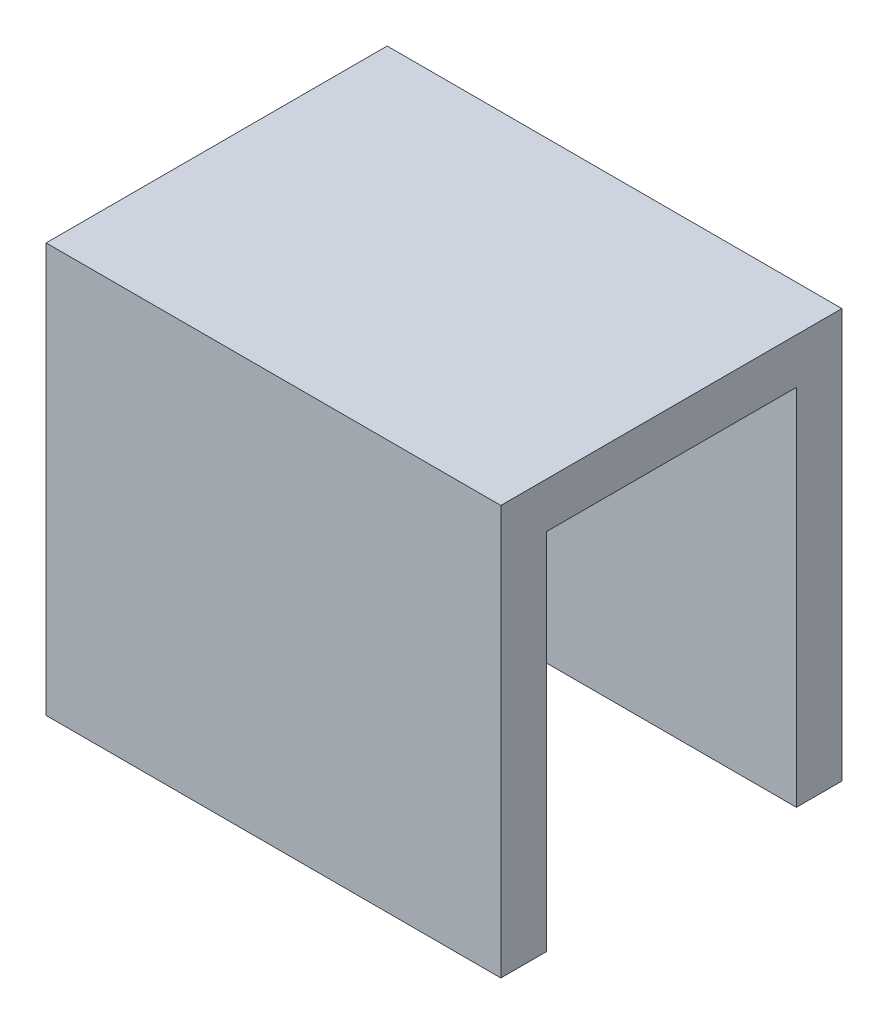
ISO-10303-21;
HEADER;
FILE_DESCRIPTION(('STEP AP214'),'2;1');
FILE_NAME('part.step','',(''),(''),'','','');
FILE_SCHEMA(('AUTOMOTIVE_DESIGN { 1 0 10303 214 1 1 1 1 }'));
ENDSEC;
DATA;
#1=APPLICATION_CONTEXT('core data for automotive mechanical design processes');
#2=APPLICATION_PROTOCOL_DEFINITION('international standard','automotive_design',2000,#1);
#3=PRODUCT_CONTEXT('',#1,'mechanical');
#4=PRODUCT('Part','Part','',(#3));
#5=PRODUCT_RELATED_PRODUCT_CATEGORY('part','',(#4));
#6=PRODUCT_DEFINITION_FORMATION('','',#4);
#7=PRODUCT_DEFINITION_CONTEXT('part definition',#1,'design');
#8=PRODUCT_DEFINITION('design','',#6,#7);
#9=PRODUCT_DEFINITION_SHAPE('','',#8);
#10=(LENGTH_UNIT() NAMED_UNIT(*) SI_UNIT(.MILLI.,.METRE.));
#11=(NAMED_UNIT(*) PLANE_ANGLE_UNIT() SI_UNIT($,.RADIAN.));
#12=(NAMED_UNIT(*) SI_UNIT($,.STERADIAN.) SOLID_ANGLE_UNIT());
#13=UNCERTAINTY_MEASURE_WITH_UNIT(LENGTH_MEASURE(1.E-05),#10,'distance_accuracy_value','');
#14=(GEOMETRIC_REPRESENTATION_CONTEXT(3) GLOBAL_UNCERTAINTY_ASSIGNED_CONTEXT((#13)) GLOBAL_UNIT_ASSIGNED_CONTEXT((#10,
#11,#12)) REPRESENTATION_CONTEXT('',''));
#15=CARTESIAN_POINT('',(0.,0.,0.));
#16=DIRECTION('',(0.,0.,1.));
#17=DIRECTION('',(1.,0.,0.));
#18=AXIS2_PLACEMENT_3D('',#15,#16,#17);
#19=CARTESIAN_POINT('',(20.,0.,4.71186440677966));
#20=DIRECTION('',(0.,1.,0.));
#21=DIRECTION('',(0.,0.,1.));
#22=AXIS2_PLACEMENT_3D('',#19,#20,#21);
#23=PLANE('',#22);
#24=DIRECTION('',(0.,0.,-1.));
#25=VECTOR('',#24,1.);
#26=CARTESIAN_POINT('',(0.,0.,4.71186440677966));
#27=LINE('',#26,#25);
#28=CARTESIAN_POINT('',(0.,0.,6.71186440677966));
#29=VERTEX_POINT('',#28);
#30=CARTESIAN_POINT('',(0.,0.,4.71186440677966));
#31=VERTEX_POINT('',#30);
#32=EDGE_CURVE('E129',#29,#31,#27,.T.);
#33=ORIENTED_EDGE('',*,*,#32,.T.);
#34=DIRECTION('',(-1.,0.,0.));
#35=VECTOR('',#34,1.);
#36=CARTESIAN_POINT('',(20.,0.,4.71186440677966));
#37=LINE('',#36,#35);
#38=CARTESIAN_POINT('',(20.,0.,4.71186440677966));
#39=VERTEX_POINT('',#38);
#40=EDGE_CURVE('E11',#39,#31,#37,.T.);
#41=ORIENTED_EDGE('',*,*,#40,.F.);
#42=DIRECTION('',(0.,0.,-1.));
#43=VECTOR('',#42,1.);
#44=CARTESIAN_POINT('',(20.,0.,4.71186440677966));
#45=LINE('',#44,#43);
#46=CARTESIAN_POINT('',(20.,0.,6.71186440677966));
#47=VERTEX_POINT('',#46);
#48=EDGE_CURVE('E143',#47,#39,#45,.T.);
#49=ORIENTED_EDGE('',*,*,#48,.F.);
#50=DIRECTION('',(-1.,0.,0.));
#51=VECTOR('',#50,1.);
#52=CARTESIAN_POINT('',(20.,0.,6.71186440677966));
#53=LINE('',#52,#51);
#54=EDGE_CURVE('E125',#47,#29,#53,.T.);
#55=ORIENTED_EDGE('',*,*,#54,.T.);
#56=EDGE_LOOP('',(#33,#41,#49,#55));
#57=FACE_BOUND('',#56,.T.);
#58=ADVANCED_FACE('F33',(#57),#23,.F.);
#59=CARTESIAN_POINT('',(20.,16.,4.71186440677966));
#60=DIRECTION('',(0.,0.,1.));
#61=DIRECTION('',(0.,-1.,0.));
#62=AXIS2_PLACEMENT_3D('',#59,#60,#61);
#63=PLANE('',#62);
#64=DIRECTION('',(0.,1.,0.));
#65=VECTOR('',#64,1.);
#66=CARTESIAN_POINT('',(0.,16.,4.71186440677966));
#67=LINE('',#66,#65);
#68=CARTESIAN_POINT('',(0.,16.,4.71186440677966));
#69=VERTEX_POINT('',#68);
#70=EDGE_CURVE('E132',#31,#69,#67,.T.);
#71=ORIENTED_EDGE('',*,*,#70,.T.);
#72=DIRECTION('',(-1.,0.,0.));
#73=VECTOR('',#72,1.);
#74=CARTESIAN_POINT('',(20.,16.,4.71186440677966));
#75=LINE('',#74,#73);
#76=CARTESIAN_POINT('',(20.,16.,4.71186440677966));
#77=VERTEX_POINT('',#76);
#78=EDGE_CURVE('E41',#77,#69,#75,.T.);
#79=ORIENTED_EDGE('',*,*,#78,.F.);
#80=DIRECTION('',(0.,1.,0.));
#81=VECTOR('',#80,1.);
#82=CARTESIAN_POINT('',(20.,16.,4.71186440677966));
#83=LINE('',#82,#81);
#84=EDGE_CURVE('E92',#39,#77,#83,.T.);
#85=ORIENTED_EDGE('',*,*,#84,.F.);
#86=ORIENTED_EDGE('',*,*,#40,.T.);
#87=EDGE_LOOP('',(#71,#79,#85,#86));
#88=FACE_BOUND('',#87,.T.);
#89=ADVANCED_FACE('F178',(#88),#63,.F.);
#90=CARTESIAN_POINT('',(20.,16.,-6.28813559322034));
#91=DIRECTION('',(0.,1.,0.));
#92=DIRECTION('',(0.,0.,1.));
#93=AXIS2_PLACEMENT_3D('',#90,#91,#92);
#94=PLANE('',#93);
#95=DIRECTION('',(0.,0.,-1.));
#96=VECTOR('',#95,1.);
#97=CARTESIAN_POINT('',(0.,16.,-6.28813559322034));
#98=LINE('',#97,#96);
#99=CARTESIAN_POINT('',(0.,16.,-6.28813559322034));
#100=VERTEX_POINT('',#99);
#101=EDGE_CURVE('E134',#69,#100,#98,.T.);
#102=ORIENTED_EDGE('',*,*,#101,.T.);
#103=DIRECTION('',(-1.,0.,0.));
#104=VECTOR('',#103,1.);
#105=CARTESIAN_POINT('',(20.,16.,-6.28813559322034));
#106=LINE('',#105,#104);
#107=CARTESIAN_POINT('',(20.,16.,-6.28813559322034));
#108=VERTEX_POINT('',#107);
#109=EDGE_CURVE('E150',#108,#100,#106,.T.);
#110=ORIENTED_EDGE('',*,*,#109,.F.);
#111=DIRECTION('',(0.,0.,-1.));
#112=VECTOR('',#111,1.);
#113=CARTESIAN_POINT('',(20.,16.,-6.28813559322034));
#114=LINE('',#113,#112);
#115=EDGE_CURVE('E158',#77,#108,#114,.T.);
#116=ORIENTED_EDGE('',*,*,#115,.F.);
#117=ORIENTED_EDGE('',*,*,#78,.T.);
#118=EDGE_LOOP('',(#102,#110,#116,#117));
#119=FACE_BOUND('',#118,.T.);
#120=ADVANCED_FACE('F156',(#119),#94,.F.);
#121=CARTESIAN_POINT('',(20.,0.,-6.28813559322034));
#122=DIRECTION('',(0.,0.,-1.));
#123=DIRECTION('',(-1.,0.,0.));
#124=AXIS2_PLACEMENT_3D('',#121,#122,#123);
#125=PLANE('',#124);
#126=DIRECTION('',(0.,-1.,0.));
#127=VECTOR('',#126,1.);
#128=CARTESIAN_POINT('',(0.,0.,-6.28813559322034));
#129=LINE('',#128,#127);
#130=CARTESIAN_POINT('',(0.,0.,-6.28813559322034));
#131=VERTEX_POINT('',#130);
#132=EDGE_CURVE('E136',#100,#131,#129,.T.);
#133=ORIENTED_EDGE('',*,*,#132,.T.);
#134=DIRECTION('',(-1.,0.,0.));
#135=VECTOR('',#134,1.);
#136=CARTESIAN_POINT('',(20.,0.,-6.28813559322034));
#137=LINE('',#136,#135);
#138=CARTESIAN_POINT('',(20.,0.,-6.28813559322034));
#139=VERTEX_POINT('',#138);
#140=EDGE_CURVE('E147',#139,#131,#137,.T.);
#141=ORIENTED_EDGE('',*,*,#140,.F.);
#142=DIRECTION('',(0.,-1.,0.));
#143=VECTOR('',#142,1.);
#144=CARTESIAN_POINT('',(20.,0.,-6.28813559322034));
#145=LINE('',#144,#143);
#146=EDGE_CURVE('E170',#108,#139,#145,.T.);
#147=ORIENTED_EDGE('',*,*,#146,.F.);
#148=ORIENTED_EDGE('',*,*,#109,.T.);
#149=EDGE_LOOP('',(#133,#141,#147,#148));
#150=FACE_BOUND('',#149,.T.);
#151=ADVANCED_FACE('F166',(#150),#125,.F.);
#152=CARTESIAN_POINT('',(20.,0.,-8.28813559322034));
#153=DIRECTION('',(0.,1.,0.));
#154=DIRECTION('',(0.,0.,1.));
#155=AXIS2_PLACEMENT_3D('',#152,#153,#154);
#156=PLANE('',#155);
#157=DIRECTION('',(0.,0.,-1.));
#158=VECTOR('',#157,1.);
#159=CARTESIAN_POINT('',(0.,0.,-8.28813559322034));
#160=LINE('',#159,#158);
#161=CARTESIAN_POINT('',(0.,0.,-8.28813559322034));
#162=VERTEX_POINT('',#161);
#163=EDGE_CURVE('E138',#131,#162,#160,.T.);
#164=ORIENTED_EDGE('',*,*,#163,.T.);
#165=DIRECTION('',(-1.,0.,0.));
#166=VECTOR('',#165,1.);
#167=CARTESIAN_POINT('',(20.,0.,-8.28813559322034));
#168=LINE('',#167,#166);
#169=CARTESIAN_POINT('',(20.,0.,-8.28813559322034));
#170=VERTEX_POINT('',#169);
#171=EDGE_CURVE('E120',#170,#162,#168,.T.);
#172=ORIENTED_EDGE('',*,*,#171,.F.);
#173=DIRECTION('',(0.,0.,-1.));
#174=VECTOR('',#173,1.);
#175=CARTESIAN_POINT('',(20.,0.,-8.28813559322034));
#176=LINE('',#175,#174);
#177=EDGE_CURVE('E111',#139,#170,#176,.T.);
#178=ORIENTED_EDGE('',*,*,#177,.F.);
#179=ORIENTED_EDGE('',*,*,#140,.T.);
#180=EDGE_LOOP('',(#164,#172,#178,#179));
#181=FACE_BOUND('',#180,.T.);
#182=ADVANCED_FACE('F169',(#181),#156,.F.);
#183=CARTESIAN_POINT('',(20.,18.,-8.28813559322034));
#184=DIRECTION('',(0.,0.,1.));
#185=DIRECTION('',(1.,0.,0.));
#186=AXIS2_PLACEMENT_3D('',#183,#184,#185);
#187=PLANE('',#186);
#188=DIRECTION('',(0.,1.,0.));
#189=VECTOR('',#188,1.);
#190=CARTESIAN_POINT('',(0.,18.,-8.28813559322034));
#191=LINE('',#190,#189);
#192=CARTESIAN_POINT('',(0.,18.,-8.28813559322034));
#193=VERTEX_POINT('',#192);
#194=EDGE_CURVE('E119',#162,#193,#191,.T.);
#195=ORIENTED_EDGE('',*,*,#194,.T.);
#196=DIRECTION('',(-1.,0.,0.));
#197=VECTOR('',#196,1.);
#198=CARTESIAN_POINT('',(20.,18.,-8.28813559322034));
#199=LINE('',#198,#197);
#200=CARTESIAN_POINT('',(20.,18.,-8.28813559322034));
#201=VERTEX_POINT('',#200);
#202=EDGE_CURVE('E116',#201,#193,#199,.T.);
#203=ORIENTED_EDGE('',*,*,#202,.F.);
#204=DIRECTION('',(0.,1.,0.));
#205=VECTOR('',#204,1.);
#206=CARTESIAN_POINT('',(20.,18.,-8.28813559322034));
#207=LINE('',#206,#205);
#208=EDGE_CURVE('E105',#170,#201,#207,.T.);
#209=ORIENTED_EDGE('',*,*,#208,.F.);
#210=ORIENTED_EDGE('',*,*,#171,.T.);
#211=EDGE_LOOP('',(#195,#203,#209,#210));
#212=FACE_BOUND('',#211,.T.);
#213=ADVANCED_FACE('F117',(#212),#187,.F.);
#214=CARTESIAN_POINT('',(20.,18.,6.71186440677966));
#215=DIRECTION('',(0.,-1.,0.));
#216=DIRECTION('',(0.,0.,-1.));
#217=AXIS2_PLACEMENT_3D('',#214,#215,#216);
#218=PLANE('',#217);
#219=DIRECTION('',(0.,0.,1.));
#220=VECTOR('',#219,1.);
#221=CARTESIAN_POINT('',(0.,18.,6.71186440677966));
#222=LINE('',#221,#220);
#223=CARTESIAN_POINT('',(0.,18.,6.71186440677966));
#224=VERTEX_POINT('',#223);
#225=EDGE_CURVE('E78',#193,#224,#222,.T.);
#226=ORIENTED_EDGE('',*,*,#225,.T.);
#227=DIRECTION('',(-1.,0.,0.));
#228=VECTOR('',#227,1.);
#229=CARTESIAN_POINT('',(20.,18.,6.71186440677966));
#230=LINE('',#229,#228);
#231=CARTESIAN_POINT('',(20.,18.,6.71186440677966));
#232=VERTEX_POINT('',#231);
#233=EDGE_CURVE('E121',#232,#224,#230,.T.);
#234=ORIENTED_EDGE('',*,*,#233,.F.);
#235=DIRECTION('',(0.,0.,1.));
#236=VECTOR('',#235,1.);
#237=CARTESIAN_POINT('',(20.,18.,6.71186440677966));
#238=LINE('',#237,#236);
#239=EDGE_CURVE('E109',#201,#232,#238,.T.);
#240=ORIENTED_EDGE('',*,*,#239,.F.);
#241=ORIENTED_EDGE('',*,*,#202,.T.);
#242=EDGE_LOOP('',(#226,#234,#240,#241));
#243=FACE_BOUND('',#242,.T.);
#244=ADVANCED_FACE('F123',(#243),#218,.F.);
#245=CARTESIAN_POINT('',(20.,0.,6.71186440677966));
#246=DIRECTION('',(0.,0.,-1.));
#247=DIRECTION('',(-1.,0.,0.));
#248=AXIS2_PLACEMENT_3D('',#245,#246,#247);
#249=PLANE('',#248);
#250=DIRECTION('',(0.,-1.,0.));
#251=VECTOR('',#250,1.);
#252=CARTESIAN_POINT('',(0.,0.,6.71186440677966));
#253=LINE('',#252,#251);
#254=EDGE_CURVE('E84',#224,#29,#253,.T.);
#255=ORIENTED_EDGE('',*,*,#254,.T.);
#256=ORIENTED_EDGE('',*,*,#54,.F.);
#257=DIRECTION('',(0.,-1.,0.));
#258=VECTOR('',#257,1.);
#259=CARTESIAN_POINT('',(20.,0.,6.71186440677966));
#260=LINE('',#259,#258);
#261=EDGE_CURVE('E49',#232,#47,#260,.T.);
#262=ORIENTED_EDGE('',*,*,#261,.F.);
#263=ORIENTED_EDGE('',*,*,#233,.T.);
#264=EDGE_LOOP('',(#255,#256,#262,#263));
#265=FACE_BOUND('',#264,.T.);
#266=ADVANCED_FACE('F194',(#265),#249,.F.);
#267=CARTESIAN_POINT('',(20.,0.,0.));
#268=DIRECTION('',(-1.,0.,0.));
#269=DIRECTION('',(0.,0.,1.));
#270=AXIS2_PLACEMENT_3D('',#267,#268,#269);
#271=PLANE('',#270);
#272=ORIENTED_EDGE('',*,*,#48,.T.);
#273=ORIENTED_EDGE('',*,*,#84,.T.);
#274=ORIENTED_EDGE('',*,*,#115,.T.);
#275=ORIENTED_EDGE('',*,*,#146,.T.);
#276=ORIENTED_EDGE('',*,*,#177,.T.);
#277=ORIENTED_EDGE('',*,*,#208,.T.);
#278=ORIENTED_EDGE('',*,*,#239,.T.);
#279=ORIENTED_EDGE('',*,*,#261,.T.);
#280=EDGE_LOOP('',(#272,#273,#274,#275,#276,#277,#278,#279));
#281=FACE_BOUND('',#280,.T.);
#282=ADVANCED_FACE('F107',(#281),#271,.F.);
#283=CARTESIAN_POINT('',(0.,0.,0.));
#284=DIRECTION('',(-1.,0.,0.));
#285=DIRECTION('',(0.,0.,1.));
#286=AXIS2_PLACEMENT_3D('',#283,#284,#285);
#287=PLANE('',#286);
#288=ORIENTED_EDGE('',*,*,#32,.F.);
#289=ORIENTED_EDGE('',*,*,#254,.F.);
#290=ORIENTED_EDGE('',*,*,#225,.F.);
#291=ORIENTED_EDGE('',*,*,#194,.F.);
#292=ORIENTED_EDGE('',*,*,#163,.F.);
#293=ORIENTED_EDGE('',*,*,#132,.F.);
#294=ORIENTED_EDGE('',*,*,#101,.F.);
#295=ORIENTED_EDGE('',*,*,#70,.F.);
#296=EDGE_LOOP('',(#288,#289,#290,#291,#292,#293,#294,#295));
#297=FACE_BOUND('',#296,.T.);
#298=ADVANCED_FACE('F162',(#297),#287,.T.);
#299=CLOSED_SHELL('',(#58,#89,#120,#151,#182,#213,#244,#266,#282,#298));
#300=MANIFOLD_SOLID_BREP('B2',#299);
#301=ADVANCED_BREP_SHAPE_REPRESENTATION('',(#18,#300),#14);
#302=SHAPE_DEFINITION_REPRESENTATION(#9,#301);
ENDSEC;
END-ISO-10303-21;
